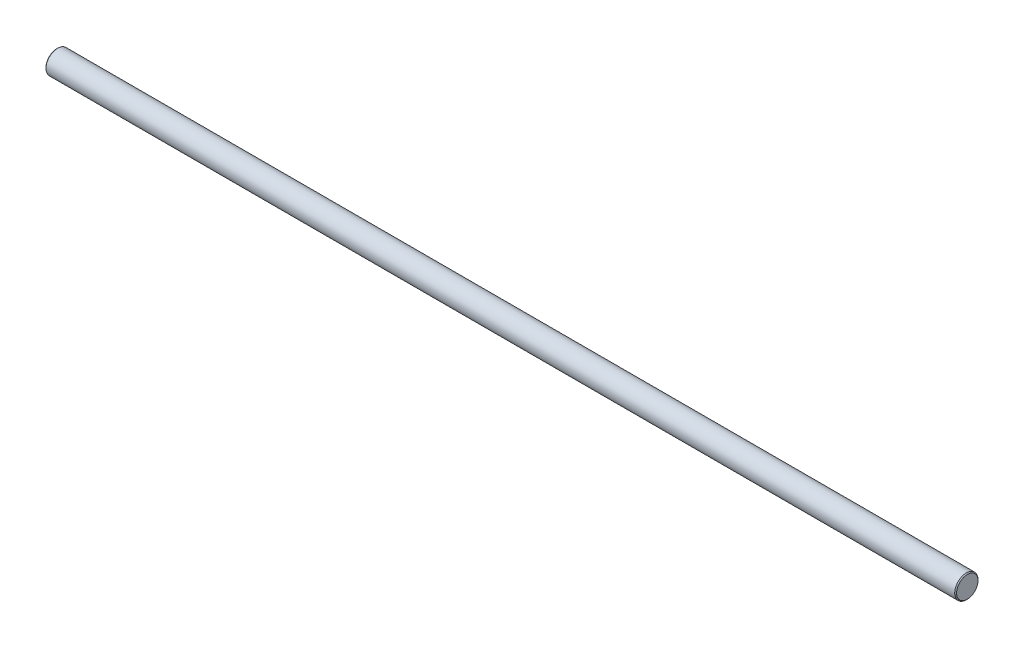
ISO-10303-21;
HEADER;
FILE_DESCRIPTION(('STEP AP214'),'2;1');
FILE_NAME('part.step','',(''),(''),'','','');
FILE_SCHEMA(('AUTOMOTIVE_DESIGN { 1 0 10303 214 1 1 1 1 }'));
ENDSEC;
DATA;
#1=APPLICATION_CONTEXT('core data for automotive mechanical design processes');
#2=APPLICATION_PROTOCOL_DEFINITION('international standard','automotive_design',2000,#1);
#3=PRODUCT_CONTEXT('',#1,'mechanical');
#4=PRODUCT('Part','Part','',(#3));
#5=PRODUCT_RELATED_PRODUCT_CATEGORY('part','',(#4));
#6=PRODUCT_DEFINITION_FORMATION('','',#4);
#7=PRODUCT_DEFINITION_CONTEXT('part definition',#1,'design');
#8=PRODUCT_DEFINITION('design','',#6,#7);
#9=PRODUCT_DEFINITION_SHAPE('','',#8);
#10=(LENGTH_UNIT() NAMED_UNIT(*) SI_UNIT(.MILLI.,.METRE.));
#11=(NAMED_UNIT(*) PLANE_ANGLE_UNIT() SI_UNIT($,.RADIAN.));
#12=(NAMED_UNIT(*) SI_UNIT($,.STERADIAN.) SOLID_ANGLE_UNIT());
#13=UNCERTAINTY_MEASURE_WITH_UNIT(LENGTH_MEASURE(1.E-05),#10,'distance_accuracy_value','');
#14=(GEOMETRIC_REPRESENTATION_CONTEXT(3) GLOBAL_UNCERTAINTY_ASSIGNED_CONTEXT((#13)) GLOBAL_UNIT_ASSIGNED_CONTEXT((#10,
#11,#12)) REPRESENTATION_CONTEXT('',''));
#15=CARTESIAN_POINT('',(0.,0.,0.));
#16=DIRECTION('',(0.,0.,1.));
#17=DIRECTION('',(1.,0.,0.));
#18=AXIS2_PLACEMENT_3D('',#15,#16,#17);
#19=CARTESIAN_POINT('',(247.65,0.,0.));
#20=DIRECTION('',(-1.,0.,0.));
#21=DIRECTION('',(0.,0.,1.));
#22=AXIS2_PLACEMENT_3D('',#19,#20,#21);
#23=CYLINDRICAL_SURFACE('',#22,6.34365);
#24=CARTESIAN_POINT('',(-247.142,0.,0.));
#25=DIRECTION('',(1.,0.,0.));
#26=DIRECTION('',(0.,0.,-1.));
#27=AXIS2_PLACEMENT_3D('',#24,#25,#26);
#28=CIRCLE('',#27,6.34365);
#29=CARTESIAN_POINT('',(-247.142,0.,-6.34365));
#30=VERTEX_POINT('',#29);
#31=EDGE_CURVE('E41',#30,#30,#28,.T.);
#32=ORIENTED_EDGE('',*,*,#31,.T.);
#33=EDGE_LOOP('',(#32));
#34=FACE_BOUND('',#33,.T.);
#35=CARTESIAN_POINT('',(247.142,0.,0.));
#36=DIRECTION('',(1.,0.,0.));
#37=DIRECTION('',(0.,0.,-1.));
#38=AXIS2_PLACEMENT_3D('',#35,#36,#37);
#39=CIRCLE('',#38,6.34365);
#40=CARTESIAN_POINT('',(247.142,0.,6.34365000000001));
#41=VERTEX_POINT('',#40);
#42=EDGE_CURVE('E45',#41,#41,#39,.F.);
#43=ORIENTED_EDGE('',*,*,#42,.T.);
#44=EDGE_LOOP('',(#43));
#45=FACE_BOUND('',#44,.T.);
#46=ADVANCED_FACE('F30',(#34,#45),#23,.T.);
#47=CARTESIAN_POINT('',(247.65,0.,0.));
#48=DIRECTION('',(1.,0.,0.));
#49=DIRECTION('',(0.,0.,-1.));
#50=AXIS2_PLACEMENT_3D('',#47,#48,#49);
#51=PLANE('',#50);
#52=CARTESIAN_POINT('',(247.65,0.,0.));
#53=DIRECTION('',(1.,0.,0.));
#54=DIRECTION('',(0.,0.,-1.));
#55=AXIS2_PLACEMENT_3D('',#52,#53,#54);
#56=CIRCLE('',#55,5.83564999999991);
#57=CARTESIAN_POINT('',(247.65,0.,5.83564999999993));
#58=VERTEX_POINT('',#57);
#59=EDGE_CURVE('E10',#58,#58,#56,.T.);
#60=ORIENTED_EDGE('',*,*,#59,.T.);
#61=EDGE_LOOP('',(#60));
#62=FACE_BOUND('',#61,.T.);
#63=ADVANCED_FACE('F61',(#62),#51,.T.);
#64=CARTESIAN_POINT('',(-247.65,0.,0.));
#65=DIRECTION('',(1.,0.,0.));
#66=DIRECTION('',(0.,0.,-1.));
#67=AXIS2_PLACEMENT_3D('',#64,#65,#66);
#68=PLANE('',#67);
#69=CARTESIAN_POINT('',(-247.65,0.,0.));
#70=DIRECTION('',(1.,0.,0.));
#71=DIRECTION('',(0.,0.,-1.));
#72=AXIS2_PLACEMENT_3D('',#69,#70,#71);
#73=CIRCLE('',#72,5.83565000000003);
#74=CARTESIAN_POINT('',(-247.65,0.,-5.83565000000003));
#75=VERTEX_POINT('',#74);
#76=EDGE_CURVE('E37',#75,#75,#73,.F.);
#77=ORIENTED_EDGE('',*,*,#76,.T.);
#78=EDGE_LOOP('',(#77));
#79=FACE_BOUND('',#78,.T.);
#80=ADVANCED_FACE('F58',(#79),#68,.F.);
#81=CARTESIAN_POINT('',(-247.142,0.,0.));
#82=DIRECTION('',(1.,0.,0.));
#83=DIRECTION('',(0.,0.,-1.));
#84=AXIS2_PLACEMENT_3D('',#81,#82,#83);
#85=CONICAL_SURFACE('',#84,6.34365,0.785398163397415);
#86=ORIENTED_EDGE('',*,*,#76,.F.);
#87=EDGE_LOOP('',(#86));
#88=FACE_BOUND('',#87,.T.);
#89=ORIENTED_EDGE('',*,*,#31,.F.);
#90=EDGE_LOOP('',(#89));
#91=FACE_BOUND('',#90,.T.);
#92=ADVANCED_FACE('F54',(#88,#91),#85,.T.);
#93=CARTESIAN_POINT('',(247.65,0.,0.));
#94=DIRECTION('',(-1.,0.,0.));
#95=DIRECTION('',(0.,0.,1.));
#96=AXIS2_PLACEMENT_3D('',#93,#94,#95);
#97=CONICAL_SURFACE('',#96,5.83564999999991,0.785398163397415);
#98=CARTESIAN_POINT('',(247.142,0.,6.34365000000001));
#99=CARTESIAN_POINT('',(247.147291666667,0.,6.33835833333335));
#100=CARTESIAN_POINT('',(247.152583333333,0.,6.33306666666668));
#101=CARTESIAN_POINT('',(247.163166666667,0.,6.32248333333335));
#102=CARTESIAN_POINT('',(247.168458333333,0.,6.31719166666668));
#103=CARTESIAN_POINT('',(247.179041666667,0.,6.30660833333334));
#104=CARTESIAN_POINT('',(247.184333333333,0.,6.30131666666667));
#105=CARTESIAN_POINT('',(247.194916666667,0.,6.29073333333334));
#106=CARTESIAN_POINT('',(247.200208333333,0.,6.28544166666667));
#107=CARTESIAN_POINT('',(247.210791666667,0.,6.27485833333334));
#108=CARTESIAN_POINT('',(247.216083333333,0.,6.26956666666667));
#109=CARTESIAN_POINT('',(247.226666666667,0.,6.25898333333333));
#110=CARTESIAN_POINT('',(247.231958333333,0.,6.25369166666667));
#111=CARTESIAN_POINT('',(247.242541666667,0.,6.24310833333333));
#112=CARTESIAN_POINT('',(247.247833333333,0.,6.23781666666666));
#113=CARTESIAN_POINT('',(247.258416666667,0.,6.22723333333333));
#114=CARTESIAN_POINT('',(247.263708333333,0.,6.22194166666666));
#115=CARTESIAN_POINT('',(247.274291666667,0.,6.21135833333333));
#116=CARTESIAN_POINT('',(247.279583333333,0.,6.20606666666666));
#117=CARTESIAN_POINT('',(247.290166666667,0.,6.19548333333332));
#118=CARTESIAN_POINT('',(247.295458333333,0.,6.19019166666665));
#119=CARTESIAN_POINT('',(247.306041666667,0.,6.17960833333332));
#120=CARTESIAN_POINT('',(247.311333333333,0.,6.17431666666665));
#121=CARTESIAN_POINT('',(247.321916666667,0.,6.16373333333332));
#122=CARTESIAN_POINT('',(247.327208333333,0.,6.15844166666665));
#123=CARTESIAN_POINT('',(247.337791666667,0.,6.14785833333331));
#124=CARTESIAN_POINT('',(247.343083333333,0.,6.14256666666665));
#125=CARTESIAN_POINT('',(247.353666666667,0.,6.13198333333331));
#126=CARTESIAN_POINT('',(247.358958333333,0.,6.12669166666664));
#127=CARTESIAN_POINT('',(247.369541666667,0.,6.11610833333331));
#128=CARTESIAN_POINT('',(247.374833333333,0.,6.11081666666664));
#129=CARTESIAN_POINT('',(247.385416666667,0.,6.10023333333331));
#130=CARTESIAN_POINT('',(247.390708333333,0.,6.09494166666664));
#131=CARTESIAN_POINT('',(247.401291666667,0.,6.0843583333333));
#132=CARTESIAN_POINT('',(247.406583333333,0.,6.07906666666664));
#133=CARTESIAN_POINT('',(247.417166666667,0.,6.0684833333333));
#134=CARTESIAN_POINT('',(247.422458333333,0.,6.06319166666663));
#135=CARTESIAN_POINT('',(247.433041666667,0.,6.0526083333333));
#136=CARTESIAN_POINT('',(247.438333333333,0.,6.04731666666663));
#137=CARTESIAN_POINT('',(247.448916666667,0.,6.0367333333333));
#138=CARTESIAN_POINT('',(247.454208333333,0.,6.03144166666663));
#139=CARTESIAN_POINT('',(247.464791666667,0.,6.02085833333329));
#140=CARTESIAN_POINT('',(247.470083333333,0.,6.01556666666662));
#141=CARTESIAN_POINT('',(247.480666666667,0.,6.00498333333329));
#142=CARTESIAN_POINT('',(247.485958333333,0.,5.99969166666662));
#143=CARTESIAN_POINT('',(247.496541666667,0.,5.98910833333329));
#144=CARTESIAN_POINT('',(247.501833333333,0.,5.98381666666662));
#145=CARTESIAN_POINT('',(247.512416666667,0.,5.97323333333328));
#146=CARTESIAN_POINT('',(247.517708333333,0.,5.96794166666662));
#147=CARTESIAN_POINT('',(247.528291666667,0.,5.95735833333328));
#148=CARTESIAN_POINT('',(247.533583333333,0.,5.95206666666662));
#149=CARTESIAN_POINT('',(247.544166666667,0.,5.94148333333328));
#150=CARTESIAN_POINT('',(247.549458333333,0.,5.93619166666661));
#151=CARTESIAN_POINT('',(247.560041666667,0.,5.92560833333328));
#152=CARTESIAN_POINT('',(247.565333333333,0.,5.92031666666661));
#153=CARTESIAN_POINT('',(247.575916666667,0.,5.90973333333328));
#154=CARTESIAN_POINT('',(247.581208333333,0.,5.90444166666661));
#155=CARTESIAN_POINT('',(247.591791666667,0.,5.89385833333327));
#156=CARTESIAN_POINT('',(247.597083333333,0.,5.8885666666666));
#157=CARTESIAN_POINT('',(247.607666666667,0.,5.87798333333327));
#158=CARTESIAN_POINT('',(247.612958333333,0.,5.8726916666666));
#159=CARTESIAN_POINT('',(247.623541666667,0.,5.86210833333327));
#160=CARTESIAN_POINT('',(247.628833333333,0.,5.8568166666666));
#161=CARTESIAN_POINT('',(247.639416666667,0.,5.84623333333326));
#162=CARTESIAN_POINT('',(247.644708333333,0.,5.84094166666659));
#163=CARTESIAN_POINT('',(247.65,0.,5.83564999999993));
#164=B_SPLINE_CURVE_WITH_KNOTS('',3,(#98,#99,#100,#101,#102,#103,#104,#105,#106,#107,#108,#109,
#110,#111,#112,#113,#114,#115,#116,#117,#118,#119,#120,#121,#122,#123,#124,#125,#126,#127,#128,
#129,#130,#131,#132,#133,#134,#135,#136,#137,#138,#139,#140,#141,#142,#143,#144,#145,#146,#147,
#148,#149,#150,#151,#152,#153,#154,#155,#156,#157,#158,#159,#160,#161,#162,#163),.UNSPECIFIED.,
.F.,.F.,(4,2,2,2,2,2,2,2,2,2,2,2,2,2,2,2,2,2,2,2,2,2,2,2,2,2,2,2,2,2,2,2,4),(0.,
0.0224506403026935,0.0449012806053668,0.0673519209080406,0.0898025612107145,0.112253201513388,
0.134703841816082,0.157154482118755,0.179605122421429,0.202055762724103,0.224506403026777,
0.24695704332947,0.269407683632144,0.291858323934817,0.314308964237491,0.336759604540165,
0.359210244842838,0.381660885145532,0.404111525448206,0.42656216575088,0.449012806053553,
0.471463446356227,0.49391408665892,0.516364726961594,0.538815367264268,0.561266007566941,
0.583716647869615,0.606167288172309,0.628617928474982,0.651068568777656,0.67351920908033,
0.695969849383003,0.718420489685697),.UNSPECIFIED.);
#165=EDGE_CURVE('BSEAM32',#41,#58,#164,.T.);
#166=ORIENTED_EDGE('',*,*,#42,.F.);
#167=ORIENTED_EDGE('',*,*,#59,.F.);
#168=ORIENTED_EDGE('',*,*,#165,.T.);
#169=ORIENTED_EDGE('',*,*,#165,.F.);
#170=EDGE_LOOP('',(#166,#168,#167,#169));
#171=FACE_BOUND('',#170,.T.);
#172=ADVANCED_FACE('F32',(#171),#97,.T.);
#173=CLOSED_SHELL('',(#46,#63,#80,#92,#172));
#174=MANIFOLD_SOLID_BREP('B2',#173);
#175=ADVANCED_BREP_SHAPE_REPRESENTATION('',(#18,#174),#14);
#176=SHAPE_DEFINITION_REPRESENTATION(#9,#175);
ENDSEC;
END-ISO-10303-21;
